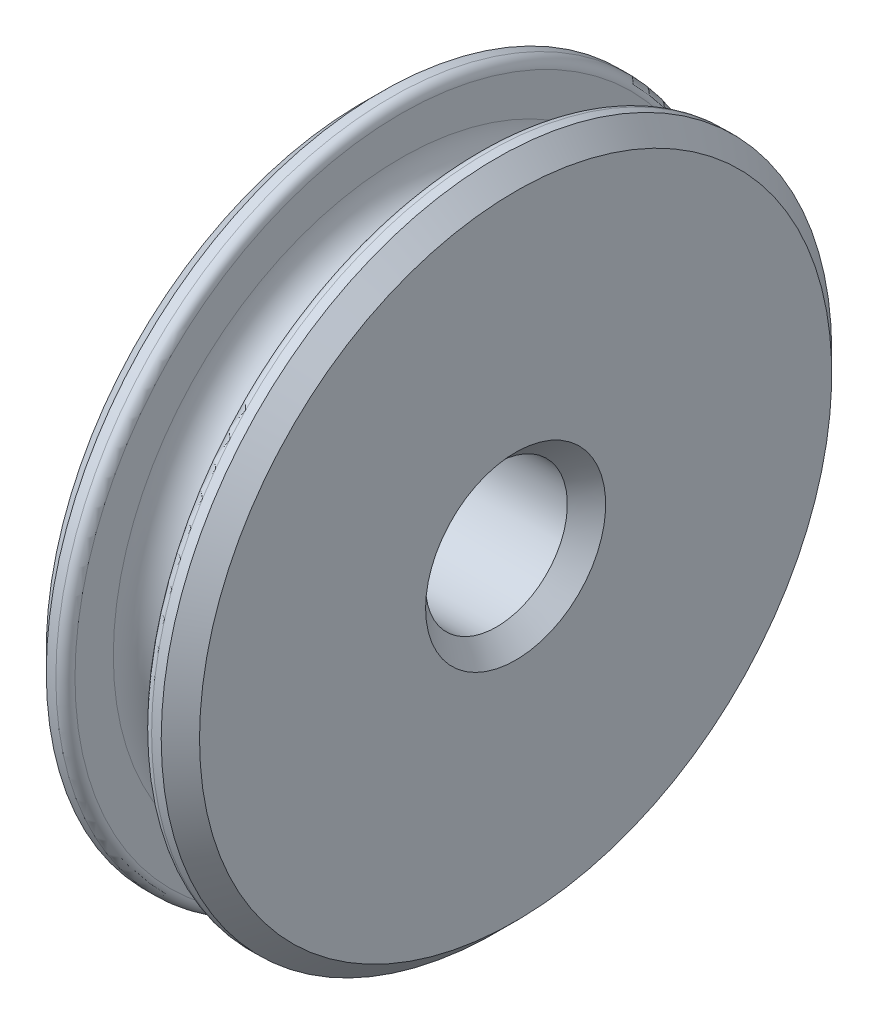
ISO-10303-21;
HEADER;
FILE_DESCRIPTION(('STEP AP214'),'2;1');
FILE_NAME('part.step','',(''),(''),'','','');
FILE_SCHEMA(('AUTOMOTIVE_DESIGN { 1 0 10303 214 1 1 1 1 }'));
ENDSEC;
DATA;
#1=APPLICATION_CONTEXT('core data for automotive mechanical design processes');
#2=APPLICATION_PROTOCOL_DEFINITION('international standard','automotive_design',2000,#1);
#3=PRODUCT_CONTEXT('',#1,'mechanical');
#4=PRODUCT('Part','Part','',(#3));
#5=PRODUCT_RELATED_PRODUCT_CATEGORY('part','',(#4));
#6=PRODUCT_DEFINITION_FORMATION('','',#4);
#7=PRODUCT_DEFINITION_CONTEXT('part definition',#1,'design');
#8=PRODUCT_DEFINITION('design','',#6,#7);
#9=PRODUCT_DEFINITION_SHAPE('','',#8);
#10=(LENGTH_UNIT() NAMED_UNIT(*) SI_UNIT(.MILLI.,.METRE.));
#11=(NAMED_UNIT(*) PLANE_ANGLE_UNIT() SI_UNIT($,.RADIAN.));
#12=(NAMED_UNIT(*) SI_UNIT($,.STERADIAN.) SOLID_ANGLE_UNIT());
#13=UNCERTAINTY_MEASURE_WITH_UNIT(LENGTH_MEASURE(1.E-05),#10,'distance_accuracy_value','');
#14=(GEOMETRIC_REPRESENTATION_CONTEXT(3) GLOBAL_UNCERTAINTY_ASSIGNED_CONTEXT((#13)) GLOBAL_UNIT_ASSIGNED_CONTEXT((#10,
#11,#12)) REPRESENTATION_CONTEXT('',''));
#15=CARTESIAN_POINT('',(0.,0.,0.));
#16=DIRECTION('',(0.,0.,1.));
#17=DIRECTION('',(1.,0.,0.));
#18=AXIS2_PLACEMENT_3D('',#15,#16,#17);
#19=CARTESIAN_POINT('',(0.,0.,0.));
#20=DIRECTION('',(-1.,0.,0.));
#21=DIRECTION('',(0.,0.,1.));
#22=AXIS2_PLACEMENT_3D('',#19,#20,#21);
#23=CYLINDRICAL_SURFACE('',#22,8.75);
#24=CARTESIAN_POINT('',(0.500000000000011,0.,0.));
#25=DIRECTION('',(1.,0.,0.));
#26=DIRECTION('',(0.,0.,-1.));
#27=AXIS2_PLACEMENT_3D('',#24,#25,#26);
#28=CIRCLE('',#27,8.75);
#29=CARTESIAN_POINT('',(0.500000000000011,0.,-8.75));
#30=VERTEX_POINT('',#29);
#31=EDGE_CURVE('E10',#30,#30,#28,.T.);
#32=ORIENTED_EDGE('',*,*,#31,.T.);
#33=EDGE_LOOP('',(#32));
#34=FACE_BOUND('',#33,.T.);
#35=CARTESIAN_POINT('',(0.75,0.,0.));
#36=DIRECTION('',(-1.,0.,0.));
#37=DIRECTION('',(0.,0.,1.));
#38=AXIS2_PLACEMENT_3D('',#35,#36,#37);
#39=CIRCLE('',#38,8.75);
#40=CARTESIAN_POINT('',(0.75,0.,8.75));
#41=VERTEX_POINT('',#40);
#42=EDGE_CURVE('E77',#41,#41,#39,.T.);
#43=ORIENTED_EDGE('',*,*,#42,.T.);
#44=EDGE_LOOP('',(#43));
#45=FACE_BOUND('',#44,.T.);
#46=ADVANCED_FACE('F41',(#34,#45),#23,.T.);
#47=CARTESIAN_POINT('',(0.,8.75,0.));
#48=DIRECTION('',(1.,0.,0.));
#49=DIRECTION('',(0.,0.,-1.));
#50=AXIS2_PLACEMENT_3D('',#47,#48,#49);
#51=PLANE('',#50);
#52=CARTESIAN_POINT('',(0.,0.,0.));
#53=DIRECTION('',(1.,0.,0.));
#54=DIRECTION('',(0.,0.,-1.));
#55=AXIS2_PLACEMENT_3D('',#52,#53,#54);
#56=CIRCLE('',#55,8.24999999999999);
#57=CARTESIAN_POINT('',(0.,0.,-8.24999999999999));
#58=VERTEX_POINT('',#57);
#59=EDGE_CURVE('E49',#58,#58,#56,.F.);
#60=ORIENTED_EDGE('',*,*,#59,.T.);
#61=EDGE_LOOP('',(#60));
#62=FACE_BOUND('',#61,.T.);
#63=CARTESIAN_POINT('',(0.,0.,0.));
#64=DIRECTION('',(1.,0.,0.));
#65=DIRECTION('',(0.,0.,-1.));
#66=AXIS2_PLACEMENT_3D('',#63,#64,#65);
#67=CIRCLE('',#66,2.35);
#68=CARTESIAN_POINT('',(0.,0.,-2.35));
#69=VERTEX_POINT('',#68);
#70=EDGE_CURVE('E53',#69,#69,#67,.T.);
#71=ORIENTED_EDGE('',*,*,#70,.T.);
#72=EDGE_LOOP('',(#71));
#73=FACE_BOUND('',#72,.T.);
#74=ADVANCED_FACE('F114',(#62,#73),#51,.F.);
#75=CARTESIAN_POINT('',(0.,0.,0.));
#76=DIRECTION('',(-1.,0.,0.));
#77=DIRECTION('',(0.,0.,1.));
#78=AXIS2_PLACEMENT_3D('',#75,#76,#77);
#79=CYLINDRICAL_SURFACE('',#78,1.85);
#80=CARTESIAN_POINT('',(3.5,0.,0.));
#81=DIRECTION('',(-1.,0.,0.));
#82=DIRECTION('',(0.,0.,1.));
#83=AXIS2_PLACEMENT_3D('',#80,#81,#82);
#84=CIRCLE('',#83,1.85);
#85=CARTESIAN_POINT('',(3.5,0.,1.85));
#86=VERTEX_POINT('',#85);
#87=EDGE_CURVE('E62',#86,#86,#84,.F.);
#88=ORIENTED_EDGE('',*,*,#87,.T.);
#89=EDGE_LOOP('',(#88));
#90=FACE_BOUND('',#89,.T.);
#91=CARTESIAN_POINT('',(0.500000000000004,0.,0.));
#92=DIRECTION('',(1.,0.,0.));
#93=DIRECTION('',(0.,0.,-1.));
#94=AXIS2_PLACEMENT_3D('',#91,#92,#93);
#95=CIRCLE('',#94,1.85);
#96=CARTESIAN_POINT('',(0.500000000000004,0.,-1.85));
#97=VERTEX_POINT('',#96);
#98=EDGE_CURVE('E65',#97,#97,#95,.F.);
#99=ORIENTED_EDGE('',*,*,#98,.T.);
#100=EDGE_LOOP('',(#99));
#101=FACE_BOUND('',#100,.T.);
#102=ADVANCED_FACE('F120',(#90,#101),#79,.F.);
#103=CARTESIAN_POINT('',(4.,1.85,0.));
#104=DIRECTION('',(-1.,0.,0.));
#105=DIRECTION('',(0.,0.,1.));
#106=AXIS2_PLACEMENT_3D('',#103,#104,#105);
#107=PLANE('',#106);
#108=CARTESIAN_POINT('',(4.,0.,0.));
#109=DIRECTION('',(-1.,0.,0.));
#110=DIRECTION('',(0.,0.,1.));
#111=AXIS2_PLACEMENT_3D('',#108,#109,#110);
#112=CIRCLE('',#111,2.35);
#113=CARTESIAN_POINT('',(4.,0.,2.35));
#114=VERTEX_POINT('',#113);
#115=EDGE_CURVE('E68',#114,#114,#112,.T.);
#116=ORIENTED_EDGE('',*,*,#115,.T.);
#117=EDGE_LOOP('',(#116));
#118=FACE_BOUND('',#117,.T.);
#119=CARTESIAN_POINT('',(4.,0.,0.));
#120=DIRECTION('',(-1.,0.,0.));
#121=DIRECTION('',(0.,0.,1.));
#122=AXIS2_PLACEMENT_3D('',#119,#120,#121);
#123=CIRCLE('',#122,8.25);
#124=CARTESIAN_POINT('',(4.,0.,8.25));
#125=VERTEX_POINT('',#124);
#126=EDGE_CURVE('E71',#125,#125,#123,.F.);
#127=ORIENTED_EDGE('',*,*,#126,.T.);
#128=EDGE_LOOP('',(#127));
#129=FACE_BOUND('',#128,.T.);
#130=ADVANCED_FACE('F110',(#118,#129),#107,.F.);
#131=CARTESIAN_POINT('',(0.,0.,0.));
#132=DIRECTION('',(-1.,0.,0.));
#133=DIRECTION('',(0.,0.,1.));
#134=AXIS2_PLACEMENT_3D('',#131,#132,#133);
#135=CYLINDRICAL_SURFACE('',#134,8.75);
#136=CARTESIAN_POINT('',(3.5,0.,0.));
#137=DIRECTION('',(-1.,0.,0.));
#138=DIRECTION('',(0.,0.,1.));
#139=AXIS2_PLACEMENT_3D('',#136,#137,#138);
#140=CIRCLE('',#139,8.75);
#141=CARTESIAN_POINT('',(3.5,0.,8.75));
#142=VERTEX_POINT('',#141);
#143=EDGE_CURVE('E57',#142,#142,#140,.T.);
#144=ORIENTED_EDGE('',*,*,#143,.T.);
#145=EDGE_LOOP('',(#144));
#146=FACE_BOUND('',#145,.T.);
#147=CARTESIAN_POINT('',(3.25,0.,0.));
#148=DIRECTION('',(1.,0.,0.));
#149=DIRECTION('',(0.,0.,-1.));
#150=AXIS2_PLACEMENT_3D('',#147,#148,#149);
#151=CIRCLE('',#150,8.75);
#152=CARTESIAN_POINT('',(3.25,0.,-8.75));
#153=VERTEX_POINT('',#152);
#154=EDGE_CURVE('E80',#153,#153,#151,.T.);
#155=ORIENTED_EDGE('',*,*,#154,.T.);
#156=EDGE_LOOP('',(#155));
#157=FACE_BOUND('',#156,.T.);
#158=ADVANCED_FACE('F103',(#146,#157),#135,.T.);
#159=CARTESIAN_POINT('',(3.,8.75,0.));
#160=DIRECTION('',(1.,0.,0.));
#161=DIRECTION('',(0.,0.,-1.));
#162=AXIS2_PLACEMENT_3D('',#159,#160,#161);
#163=PLANE('',#162);
#164=CARTESIAN_POINT('',(3.,0.,0.));
#165=DIRECTION('',(1.,0.,0.));
#166=DIRECTION('',(0.,0.,-1.));
#167=AXIS2_PLACEMENT_3D('',#164,#165,#166);
#168=CIRCLE('',#167,8.5);
#169=CARTESIAN_POINT('',(3.,0.,-8.5));
#170=VERTEX_POINT('',#169);
#171=EDGE_CURVE('E83',#170,#170,#168,.F.);
#172=ORIENTED_EDGE('',*,*,#171,.T.);
#173=EDGE_LOOP('',(#172));
#174=FACE_BOUND('',#173,.T.);
#175=CARTESIAN_POINT('',(3.,0.,0.));
#176=DIRECTION('',(-1.,0.,0.));
#177=DIRECTION('',(0.,0.,1.));
#178=AXIS2_PLACEMENT_3D('',#175,#176,#177);
#179=CIRCLE('',#178,7.5);
#180=CARTESIAN_POINT('',(3.,0.,7.5));
#181=VERTEX_POINT('',#180);
#182=EDGE_CURVE('E86',#181,#181,#179,.T.);
#183=ORIENTED_EDGE('',*,*,#182,.F.);
#184=EDGE_LOOP('',(#183));
#185=FACE_BOUND('',#184,.T.);
#186=ADVANCED_FACE('F98',(#174,#185),#163,.F.);
#187=CARTESIAN_POINT('',(2.,0.,0.));
#188=DIRECTION('',(-1.,0.,0.));
#189=DIRECTION('',(0.,0.,1.));
#190=AXIS2_PLACEMENT_3D('',#187,#188,#189);
#191=TOROIDAL_SURFACE('',#190,7.5,1.);
#192=CARTESIAN_POINT('',(1.,0.,0.));
#193=DIRECTION('',(-1.,0.,0.));
#194=DIRECTION('',(0.,0.,1.));
#195=AXIS2_PLACEMENT_3D('',#192,#193,#194);
#196=CIRCLE('',#195,7.5);
#197=CARTESIAN_POINT('',(1.,0.,7.5));
#198=VERTEX_POINT('',#197);
#199=EDGE_CURVE('E89',#198,#198,#196,.T.);
#200=ORIENTED_EDGE('',*,*,#199,.F.);
#201=EDGE_LOOP('',(#200));
#202=FACE_BOUND('',#201,.T.);
#203=ORIENTED_EDGE('',*,*,#182,.T.);
#204=EDGE_LOOP('',(#203));
#205=FACE_BOUND('',#204,.T.);
#206=ADVANCED_FACE('F95',(#202,#205),#191,.F.);
#207=CARTESIAN_POINT('',(1.,7.5,0.));
#208=DIRECTION('',(-1.,0.,0.));
#209=DIRECTION('',(0.,0.,1.));
#210=AXIS2_PLACEMENT_3D('',#207,#208,#209);
#211=PLANE('',#210);
#212=CARTESIAN_POINT('',(1.,0.,0.));
#213=DIRECTION('',(-1.,0.,0.));
#214=DIRECTION('',(0.,0.,1.));
#215=AXIS2_PLACEMENT_3D('',#212,#213,#214);
#216=CIRCLE('',#215,8.5);
#217=CARTESIAN_POINT('',(1.,0.,8.5));
#218=VERTEX_POINT('',#217);
#219=EDGE_CURVE('E74',#218,#218,#216,.F.);
#220=ORIENTED_EDGE('',*,*,#219,.T.);
#221=EDGE_LOOP('',(#220));
#222=FACE_BOUND('',#221,.T.);
#223=ORIENTED_EDGE('',*,*,#199,.T.);
#224=EDGE_LOOP('',(#223));
#225=FACE_BOUND('',#224,.T.);
#226=ADVANCED_FACE('F93',(#222,#225),#211,.F.);
#227=CARTESIAN_POINT('',(3.25,0.,0.));
#228=DIRECTION('',(1.,0.,0.));
#229=DIRECTION('',(0.,0.,-1.));
#230=AXIS2_PLACEMENT_3D('',#227,#228,#229);
#231=TOROIDAL_SURFACE('',#230,8.5,0.25);
#232=ORIENTED_EDGE('',*,*,#154,.F.);
#233=EDGE_LOOP('',(#232));
#234=FACE_BOUND('',#233,.T.);
#235=ORIENTED_EDGE('',*,*,#171,.F.);
#236=EDGE_LOOP('',(#235));
#237=FACE_BOUND('',#236,.T.);
#238=ADVANCED_FACE('F125',(#234,#237),#231,.T.);
#239=CARTESIAN_POINT('',(0.75,0.,0.));
#240=DIRECTION('',(-1.,0.,0.));
#241=DIRECTION('',(0.,0.,1.));
#242=AXIS2_PLACEMENT_3D('',#239,#240,#241);
#243=TOROIDAL_SURFACE('',#242,8.5,0.25);
#244=ORIENTED_EDGE('',*,*,#219,.F.);
#245=EDGE_LOOP('',(#244));
#246=FACE_BOUND('',#245,.T.);
#247=ORIENTED_EDGE('',*,*,#42,.F.);
#248=EDGE_LOOP('',(#247));
#249=FACE_BOUND('',#248,.T.);
#250=ADVANCED_FACE('F128',(#246,#249),#243,.T.);
#251=CARTESIAN_POINT('',(4.,0.,0.));
#252=DIRECTION('',(1.,0.,0.));
#253=DIRECTION('',(0.,0.,-1.));
#254=AXIS2_PLACEMENT_3D('',#251,#252,#253);
#255=CONICAL_SURFACE('',#254,2.35,0.785398163397447);
#256=ORIENTED_EDGE('',*,*,#87,.F.);
#257=EDGE_LOOP('',(#256));
#258=FACE_BOUND('',#257,.T.);
#259=ORIENTED_EDGE('',*,*,#115,.F.);
#260=EDGE_LOOP('',(#259));
#261=FACE_BOUND('',#260,.T.);
#262=ADVANCED_FACE('F131',(#258,#261),#255,.F.);
#263=CARTESIAN_POINT('',(3.5,0.,0.));
#264=DIRECTION('',(-1.,0.,0.));
#265=DIRECTION('',(0.,0.,1.));
#266=AXIS2_PLACEMENT_3D('',#263,#264,#265);
#267=CONICAL_SURFACE('',#266,8.75,0.78539816339745);
#268=ORIENTED_EDGE('',*,*,#126,.F.);
#269=EDGE_LOOP('',(#268));
#270=FACE_BOUND('',#269,.T.);
#271=ORIENTED_EDGE('',*,*,#143,.F.);
#272=EDGE_LOOP('',(#271));
#273=FACE_BOUND('',#272,.T.);
#274=ADVANCED_FACE('F139',(#270,#273),#267,.T.);
#275=CARTESIAN_POINT('',(0.,0.,0.));
#276=DIRECTION('',(1.,0.,0.));
#277=DIRECTION('',(0.,0.,-1.));
#278=AXIS2_PLACEMENT_3D('',#275,#276,#277);
#279=CONICAL_SURFACE('',#278,8.24999999999999,0.785398163397445);
#280=ORIENTED_EDGE('',*,*,#31,.F.);
#281=EDGE_LOOP('',(#280));
#282=FACE_BOUND('',#281,.T.);
#283=ORIENTED_EDGE('',*,*,#59,.F.);
#284=EDGE_LOOP('',(#283));
#285=FACE_BOUND('',#284,.T.);
#286=ADVANCED_FACE('F145',(#282,#285),#279,.T.);
#287=CARTESIAN_POINT('',(0.500000000000004,0.,0.));
#288=DIRECTION('',(-1.,0.,0.));
#289=DIRECTION('',(0.,0.,1.));
#290=AXIS2_PLACEMENT_3D('',#287,#288,#289);
#291=CONICAL_SURFACE('',#290,1.85,0.785398163397449);
#292=ORIENTED_EDGE('',*,*,#70,.F.);
#293=EDGE_LOOP('',(#292));
#294=FACE_BOUND('',#293,.T.);
#295=ORIENTED_EDGE('',*,*,#98,.F.);
#296=EDGE_LOOP('',(#295));
#297=FACE_BOUND('',#296,.T.);
#298=ADVANCED_FACE('F44',(#294,#297),#291,.F.);
#299=CLOSED_SHELL('',(#46,#74,#102,#130,#158,#186,#206,#226,#238,#250,#262,#274,#286,#298));
#300=MANIFOLD_SOLID_BREP('B2',#299);
#301=ADVANCED_BREP_SHAPE_REPRESENTATION('',(#18,#300),#14);
#302=SHAPE_DEFINITION_REPRESENTATION(#9,#301);
ENDSEC;
END-ISO-10303-21;
